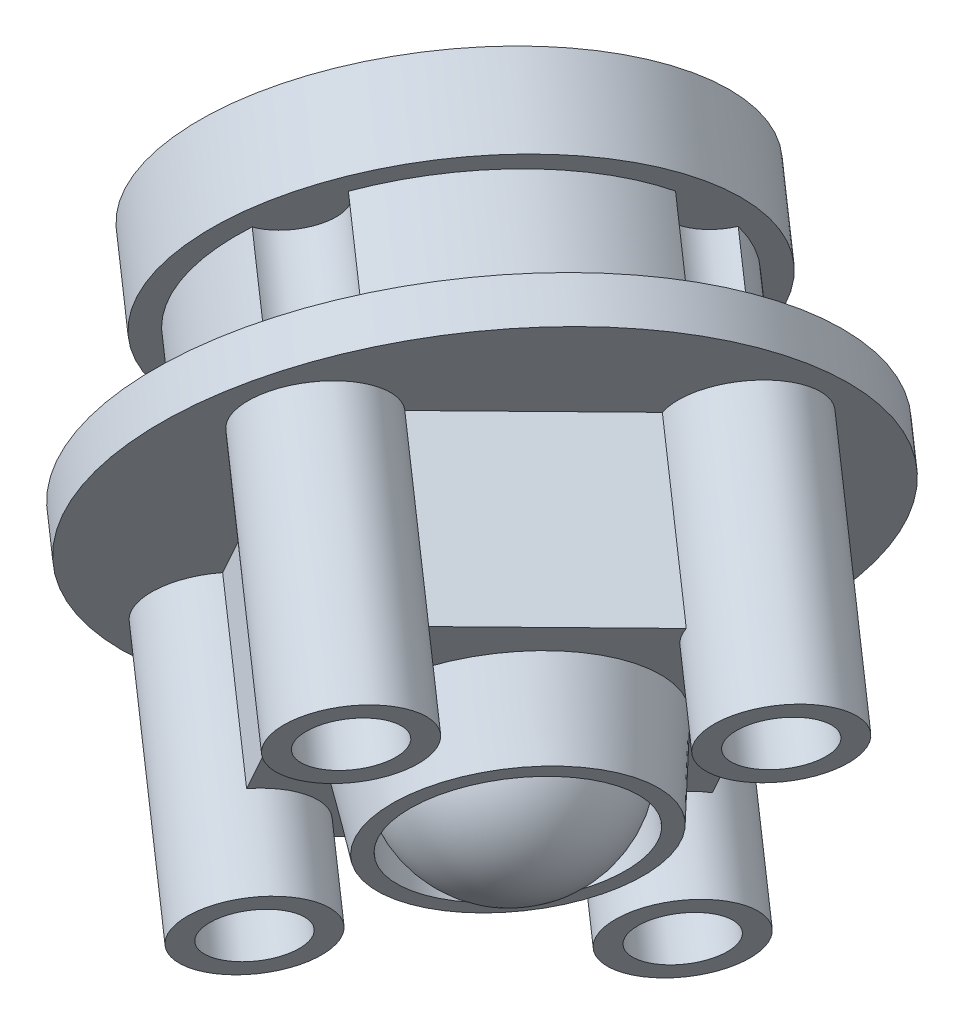
ISO-10303-21;
HEADER;
FILE_DESCRIPTION(('STEP AP214'),'2;1');
FILE_NAME('part.step','',(''),(''),'','','');
FILE_SCHEMA(('AUTOMOTIVE_DESIGN { 1 0 10303 214 1 1 1 1 }'));
ENDSEC;
DATA;
#1=APPLICATION_CONTEXT('core data for automotive mechanical design processes');
#2=APPLICATION_PROTOCOL_DEFINITION('international standard','automotive_design',2000,#1);
#3=PRODUCT_CONTEXT('',#1,'mechanical');
#4=PRODUCT('Part','Part','',(#3));
#5=PRODUCT_RELATED_PRODUCT_CATEGORY('part','',(#4));
#6=PRODUCT_DEFINITION_FORMATION('','',#4);
#7=PRODUCT_DEFINITION_CONTEXT('part definition',#1,'design');
#8=PRODUCT_DEFINITION('design','',#6,#7);
#9=PRODUCT_DEFINITION_SHAPE('','',#8);
#10=(LENGTH_UNIT() NAMED_UNIT(*) SI_UNIT(.MILLI.,.METRE.));
#11=(NAMED_UNIT(*) PLANE_ANGLE_UNIT() SI_UNIT($,.RADIAN.));
#12=(NAMED_UNIT(*) SI_UNIT($,.STERADIAN.) SOLID_ANGLE_UNIT());
#13=UNCERTAINTY_MEASURE_WITH_UNIT(LENGTH_MEASURE(1.E-05),#10,'distance_accuracy_value','');
#14=(GEOMETRIC_REPRESENTATION_CONTEXT(3) GLOBAL_UNCERTAINTY_ASSIGNED_CONTEXT((#13)) GLOBAL_UNIT_ASSIGNED_CONTEXT((#10,
#11,#12)) REPRESENTATION_CONTEXT('',''));
#15=CARTESIAN_POINT('',(0.,0.,0.));
#16=DIRECTION('',(0.,0.,1.));
#17=DIRECTION('',(1.,0.,0.));
#18=AXIS2_PLACEMENT_3D('',#15,#16,#17);
#19=CARTESIAN_POINT('',(174.649711908998,10.1944766292287,115.613424248542));
#20=DIRECTION('',(0.683170517972146,-0.488891727051665,0.54246006543718));
#21=DIRECTION('',(0.621841580193138,0.,-0.783143057903791));
#22=AXIS2_PLACEMENT_3D('',#19,#20,#21);
#23=CYLINDRICAL_SURFACE('',#22,5.01330239581798);
#24=CARTESIAN_POINT('',(176.699223462915,8.72780144807371,117.240804444854));
#25=DIRECTION('',(-0.683170517972146,0.488891727051666,-0.54246006543718));
#26=DIRECTION('',(-0.621841580193138,0.,0.783143057903791));
#27=AXIS2_PLACEMENT_3D('',#24,#25,#26);
#28=CIRCLE('',#27,5.01330239581798);
#29=CARTESIAN_POINT('',(176.195318190787,4.72360210727117,114.266637666115));
#30=VERTEX_POINT('',#29);
#31=CARTESIAN_POINT('',(173.151351657622,5.58709043908616,118.87840663194));
#32=VERTEX_POINT('',#31);
#33=EDGE_CURVE('E156',#30,#32,#28,.T.);
#34=ORIENTED_EDGE('',*,*,#33,.T.);
#35=DIRECTION('',(0.683170517972146,-0.488891727051666,0.54246006543718));
#36=VECTOR('',#35,1.);
#37=CARTESIAN_POINT('',(174.517692693566,4.60930698498274,119.963326762814));
#38=LINE('',#37,#36);
#39=CARTESIAN_POINT('',(171.101840103706,7.05376562024106,117.251026435628));
#40=VERTEX_POINT('',#39);
#41=EDGE_CURVE('E151',#32,#40,#38,.F.);
#42=ORIENTED_EDGE('',*,*,#41,.T.);
#43=CARTESIAN_POINT('',(174.649711908998,10.1944766292287,115.613424248542));
#44=DIRECTION('',(-0.683170517972146,0.488891727051666,-0.54246006543718));
#45=DIRECTION('',(-0.621841580193138,0.,0.783143057903791));
#46=AXIS2_PLACEMENT_3D('',#43,#44,#45);
#47=CIRCLE('',#46,5.01330239581798);
#48=CARTESIAN_POINT('',(174.145806636871,6.19027728842616,112.639257469804));
#49=VERTEX_POINT('',#48);
#50=EDGE_CURVE('E153',#49,#40,#47,.T.);
#51=ORIENTED_EDGE('',*,*,#50,.F.);
#52=DIRECTION('',(0.683170517972146,-0.488891727051666,0.54246006543718));
#53=VECTOR('',#52,1.);
#54=CARTESIAN_POINT('',(177.561659226731,3.74581865316777,115.35155779699));
#55=LINE('',#54,#53);
#56=EDGE_CURVE('E61',#49,#30,#55,.T.);
#57=ORIENTED_EDGE('',*,*,#56,.T.);
#58=EDGE_LOOP('',(#34,#42,#51,#57));
#59=FACE_BOUND('',#58,.T.);
#60=ADVANCED_FACE('F38',(#59),#23,.T.);
#61=CARTESIAN_POINT('',(171.019962030818,8.40674297223875,118.573512947455));
#62=VERTEX_POINT('',#61);
#63=CARTESIAN_POINT('',(173.652296445753,13.1529580790304,119.535891688404));
#64=VERTEX_POINT('',#63);
#65=EDGE_CURVE('E174',#62,#64,#47,.T.);
#66=ORIENTED_EDGE('',*,*,#65,.F.);
#67=DIRECTION('',(0.683170517972146,-0.488891727051666,0.54246006543718));
#68=VECTOR('',#67,1.);
#69=CARTESIAN_POINT('',(174.435814620679,5.96228433698036,121.285813274641));
#70=LINE('',#69,#68);
#71=CARTESIAN_POINT('',(173.069473584734,6.94006779108375,120.200893143766));
#72=VERTEX_POINT('',#71);
#73=EDGE_CURVE('E53',#62,#72,#70,.T.);
#74=ORIENTED_EDGE('',*,*,#73,.T.);
#75=CARTESIAN_POINT('',(175.70180799967,11.6862828978755,121.163271884715));
#76=VERTEX_POINT('',#75);
#77=EDGE_CURVE('E182',#72,#76,#28,.T.);
#78=ORIENTED_EDGE('',*,*,#77,.T.);
#79=DIRECTION('',(0.683170517972146,-0.488891727051666,0.54246006543718));
#80=VECTOR('',#79,1.);
#81=CARTESIAN_POINT('',(177.068149035614,10.7084994437721,122.24819201559));
#82=LINE('',#81,#80);
#83=EDGE_CURVE('E375',#76,#64,#82,.F.);
#84=ORIENTED_EDGE('',*,*,#83,.T.);
#85=EDGE_LOOP('',(#66,#74,#78,#84));
#86=FACE_BOUND('',#85,.T.);
#87=ADVANCED_FACE('F320',(#86),#23,.T.);
#88=CARTESIAN_POINT('',(180.339477568334,10.6117459060663,114.354196705813));
#89=VERTEX_POINT('',#88);
#90=CARTESIAN_POINT('',(177.609985412819,5.69125263493153,113.357109697848));
#91=VERTEX_POINT('',#90);
#92=EDGE_CURVE('E350',#89,#91,#28,.T.);
#93=ORIENTED_EDGE('',*,*,#92,.T.);
#94=DIRECTION('',(0.683170517972146,-0.488891727051666,0.54246006543718));
#95=VECTOR('',#94,1.);
#96=CARTESIAN_POINT('',(178.976326448763,4.7134691808281,114.442029828722));
#97=LINE('',#96,#95);
#98=CARTESIAN_POINT('',(175.560473858903,7.15792781608643,111.729729501536));
#99=VERTEX_POINT('',#98);
#100=EDGE_CURVE('E352',#91,#99,#97,.F.);
#101=ORIENTED_EDGE('',*,*,#100,.T.);
#102=CARTESIAN_POINT('',(178.289966014417,12.0784210872213,112.726816509501));
#103=VERTEX_POINT('',#102);
#104=EDGE_CURVE('E173',#103,#99,#47,.T.);
#105=ORIENTED_EDGE('',*,*,#104,.F.);
#106=DIRECTION('',(0.683170517972146,-0.488891727051666,0.54246006543718));
#107=VECTOR('',#106,1.);
#108=CARTESIAN_POINT('',(181.705818604278,9.63396245196293,115.439116836687));
#109=LINE('',#108,#107);
#110=EDGE_CURVE('E158',#103,#89,#109,.T.);
#111=ORIENTED_EDGE('',*,*,#110,.T.);
#112=EDGE_LOOP('',(#93,#101,#105,#111));
#113=FACE_BOUND('',#112,.T.);
#114=ADVANCED_FACE('F325',(#113),#23,.T.);
#115=CARTESIAN_POINT('',(180.100401983922,6.3239308852218,120.008165164388));
#116=DIRECTION('',(-0.683170517972146,0.488891727051666,-0.54246006543718));
#117=DIRECTION('',(0.621841580193138,0.,-0.783143057903791));
#118=AXIS2_PLACEMENT_3D('',#115,#116,#117);
#119=CONICAL_SURFACE('',#118,3.08209004523426,0.139626340159546);
#120=CARTESIAN_POINT('',(181.466743019866,5.34614743111847,121.093085295262));
#121=DIRECTION('',(0.683170517972146,-0.488891727051666,0.54246006543718));
#122=DIRECTION('',(0.621841580193138,0.,-0.783143057903791));
#123=AXIS2_PLACEMENT_3D('',#120,#121,#122);
#124=CIRCLE('',#123,2.80100837582948);
#125=CARTESIAN_POINT('',(183.208526494426,5.34614743111847,118.899495030601));
#126=VERTEX_POINT('',#125);
#127=EDGE_CURVE('E11',#126,#126,#124,.T.);
#128=ORIENTED_EDGE('',*,*,#127,.F.);
#129=EDGE_LOOP('',(#128));
#130=FACE_BOUND('',#129,.T.);
#131=CARTESIAN_POINT('',(180.100401983922,6.3239308852218,120.008165164388));
#132=DIRECTION('',(0.683170517972146,-0.488891727051666,0.54246006543718));
#133=DIRECTION('',(0.621841580193138,0.,-0.783143057903791));
#134=AXIS2_PLACEMENT_3D('',#131,#132,#133);
#135=CIRCLE('',#134,3.08209004523426);
#136=CARTESIAN_POINT('',(182.016973727948,6.3239308852218,117.594447741628));
#137=VERTEX_POINT('',#136);
#138=EDGE_CURVE('E213',#137,#137,#135,.T.);
#139=ORIENTED_EDGE('',*,*,#138,.T.);
#140=EDGE_LOOP('',(#139));
#141=FACE_BOUND('',#140,.T.);
#142=ADVANCED_FACE('F220',(#130,#141),#119,.T.);
#143=CARTESIAN_POINT('',(181.466743019866,5.34614743111847,121.093085295262));
#144=DIRECTION('',(0.683170517972146,-0.488891727051666,0.54246006543718));
#145=DIRECTION('',(0.621841580193138,0.,-0.783143057903791));
#146=AXIS2_PLACEMENT_3D('',#143,#144,#145);
#147=PLANE('',#146);
#148=CARTESIAN_POINT('',(181.466743019866,5.34614743111841,121.093085295262));
#149=DIRECTION('',(0.683170517972146,-0.488891727051666,0.54246006543718));
#150=DIRECTION('',(0.621841580193138,0.,-0.783143057903791));
#151=AXIS2_PLACEMENT_3D('',#148,#149,#150);
#152=CIRCLE('',#151,2.40864300072666);
#153=CARTESIAN_POINT('',(182.964537389559,5.34614743111841,119.206773250274));
#154=VERTEX_POINT('',#153);
#155=EDGE_CURVE('E214',#154,#154,#152,.T.);
#156=ORIENTED_EDGE('',*,*,#155,.F.);
#157=EDGE_LOOP('',(#156));
#158=FACE_BOUND('',#157,.T.);
#159=ORIENTED_EDGE('',*,*,#127,.T.);
#160=EDGE_LOOP('',(#159));
#161=FACE_BOUND('',#160,.T.);
#162=ADVANCED_FACE('F344',(#158,#161),#147,.T.);
#163=CARTESIAN_POINT('',(180.783572501894,5.83503915817008,120.550625229825));
#164=DIRECTION('',(0.683170517972146,-0.488891727051666,0.54246006543718));
#165=DIRECTION('',(0.621841580193138,0.,-0.783143057903791));
#166=AXIS2_PLACEMENT_3D('',#163,#164,#165);
#167=CYLINDRICAL_SURFACE('',#166,2.40864300072666);
#168=CARTESIAN_POINT('',(180.783572501894,5.83503915817008,120.550625229825));
#169=DIRECTION('',(0.683170517972146,-0.488891727051666,0.54246006543718));
#170=DIRECTION('',(0.621841580193138,0.,-0.783143057903791));
#171=AXIS2_PLACEMENT_3D('',#168,#169,#170);
#172=CIRCLE('',#171,2.40864300072666);
#173=CARTESIAN_POINT('',(182.281366871587,5.83503915817008,118.664313184837));
#174=VERTEX_POINT('',#173);
#175=EDGE_CURVE('E42',#174,#174,#172,.T.);
#176=ORIENTED_EDGE('',*,*,#175,.F.);
#177=EDGE_LOOP('',(#176));
#178=FACE_BOUND('',#177,.T.);
#179=ORIENTED_EDGE('',*,*,#155,.T.);
#180=EDGE_LOOP('',(#179));
#181=FACE_BOUND('',#180,.T.);
#182=ADVANCED_FACE('F480',(#178,#181),#167,.F.);
#183=CARTESIAN_POINT('',(180.475879143588,6.05523123816705,120.306306491105));
#184=DIRECTION('',(0.,0.,1.));
#185=DIRECTION('',(1.,0.,0.));
#186=AXIS2_PLACEMENT_3D('',#183,#184,#185);
#187=SPHERICAL_SURFACE('',#186,2.45039027623739);
#188=CARTESIAN_POINT('',(180.475879143588,6.05523123816705,120.306306491105));
#189=DIRECTION('',(0.683170517972146,-0.488891727051666,0.54246006543718));
#190=DIRECTION('',(0.621841580193138,0.,-0.783143057903791));
#191=AXIS2_PLACEMENT_3D('',#188,#189,#190);
#192=SPHERICAL_SURFACE('',#191,2.45039027623739);
#193=ORIENTED_EDGE('',*,*,#175,.T.);
#194=EDGE_LOOP('',(#193));
#195=FACE_BOUND('',#194,.T.);
#196=ADVANCED_FACE('F40',(#195),#192,.T.);
#197=CARTESIAN_POINT('',(123.848229960972,-89.7875099438735,104.231404175565));
#198=DIRECTION('',(-0.549312188007974,0.145426232650755,0.822865317632783));
#199=DIRECTION('',(0.831707114977743,0.,0.555214620570639));
#200=AXIS2_PLACEMENT_3D('',#197,#198,#199);
#201=PLANE('',#200);
#202=DIRECTION('',(-0.481179969948417,-0.860137250720751,-0.169203269598991));
#203=VECTOR('',#202,1.);
#204=CARTESIAN_POINT('',(173.74160531901,6.24020289946287,120.567115972025));
#205=LINE('',#204,#203);
#206=CARTESIAN_POINT('',(176.211888789104,10.6559786282308,121.435772329482));
#207=VERTEX_POINT('',#206);
#208=CARTESIAN_POINT('',(174.123093296577,6.92213490141914,120.701263312207));
#209=VERTEX_POINT('',#208);
#210=EDGE_CURVE('E190',#207,#209,#205,.T.);
#211=ORIENTED_EDGE('',*,*,#210,.T.);
#212=DIRECTION('',(-0.683170517972146,0.488891727051666,-0.54246006543718));
#213=VECTOR('',#212,1.);
#214=CARTESIAN_POINT('',(178.22211640441,3.98878453910911,123.95602370483));
#215=LINE('',#214,#213);
#216=CARTESIAN_POINT('',(176.855775368466,4.96656799321248,122.871103573956));
#217=VERTEX_POINT('',#216);
#218=EDGE_CURVE('E387',#209,#217,#215,.F.);
#219=ORIENTED_EDGE('',*,*,#218,.T.);
#220=DIRECTION('',(0.48117996994842,0.860137250720749,0.169203269598993));
#221=VECTOR('',#220,1.);
#222=CARTESIAN_POINT('',(123.848229960972,-89.7875099438735,104.231404175565));
#223=LINE('',#222,#221);
#224=CARTESIAN_POINT('',(178.944570860992,8.70041172002413,123.60561259123));
#225=VERTEX_POINT('',#224);
#226=EDGE_CURVE('E229',#217,#225,#223,.T.);
#227=ORIENTED_EDGE('',*,*,#226,.T.);
#228=DIRECTION('',(-0.683170517972146,0.488891727051666,-0.54246006543718));
#229=VECTOR('',#228,1.);
#230=CARTESIAN_POINT('',(180.310911896937,7.72262826592077,124.690532722105));
#231=LINE('',#230,#229);
#232=EDGE_CURVE('E258',#225,#207,#231,.T.);
#233=ORIENTED_EDGE('',*,*,#232,.T.);
#234=EDGE_LOOP('',(#211,#219,#227,#233));
#235=FACE_BOUND('',#234,.T.);
#236=ADVANCED_FACE('F390',(#235),#201,.T.);
#237=CARTESIAN_POINT('',(178.563672039093,2.74396126774131,118.717067475701));
#238=DIRECTION('',(-0.481179969948421,-0.860137250720748,-0.169203269598991));
#239=DIRECTION('',(0.872720859607662,-0.488219521532746,0.));
#240=AXIS2_PLACEMENT_3D('',#237,#238,#239);
#241=PLANE('',#240);
#242=DIRECTION('',(-0.549312188007973,0.145426232650758,0.822865317632784));
#243=VECTOR('',#242,1.);
#244=CARTESIAN_POINT('',(178.563672039093,2.74396126774131,118.717067475701));
#245=LINE('',#244,#243);
#246=CARTESIAN_POINT('',(179.370762845876,2.53029010223683,117.5080518238));
#247=VERTEX_POINT('',#246);
#248=CARTESIAN_POINT('',(176.944833481188,3.17253648941936,121.142074845331));
#249=VERTEX_POINT('',#248);
#250=EDGE_CURVE('E237',#247,#249,#245,.T.);
#251=ORIENTED_EDGE('',*,*,#250,.T.);
#252=DIRECTION('',(-0.683170517972146,0.488891727051666,-0.54246006543718));
#253=VECTOR('',#252,1.);
#254=CARTESIAN_POINT('',(178.311174517132,2.19475303531599,122.226994976206));
#255=LINE('',#254,#253);
#256=CARTESIAN_POINT('',(174.212151409299,5.12810339762605,118.972234583582));
#257=VERTEX_POINT('',#256);
#258=EDGE_CURVE('E385',#249,#257,#255,.T.);
#259=ORIENTED_EDGE('',*,*,#258,.T.);
#260=DIRECTION('',(0.549312188007974,-0.145426232650759,-0.822865317632782));
#261=VECTOR('',#260,1.);
#262=CARTESIAN_POINT('',(177.105610665117,4.36208202018682,114.637855478997));
#263=LINE('',#262,#261);
#264=CARTESIAN_POINT('',(176.638080773988,4.48585701044353,115.338211562051));
#265=VERTEX_POINT('',#264);
#266=EDGE_CURVE('E193',#257,#265,#263,.T.);
#267=ORIENTED_EDGE('',*,*,#266,.T.);
#268=DIRECTION('',(-0.683170517972146,0.488891727051666,-0.54246006543718));
#269=VECTOR('',#268,1.);
#270=CARTESIAN_POINT('',(180.73710388182,1.55250664813348,118.592971954674));
#271=LINE('',#270,#269);
#272=EDGE_CURVE('E243',#265,#247,#271,.F.);
#273=ORIENTED_EDGE('',*,*,#272,.T.);
#274=EDGE_LOOP('',(#251,#259,#267,#273));
#275=FACE_BOUND('',#274,.T.);
#276=ADVANCED_FACE('F278',(#275),#241,.T.);
#277=CARTESIAN_POINT('',(182.413111798681,9.62505927350733,120.070693632493));
#278=DIRECTION('',(-0.481179969948422,-0.860137250720748,-0.169203269598989));
#279=DIRECTION('',(0.872720859607662,-0.488219521532747,0.));
#280=AXIS2_PLACEMENT_3D('',#277,#278,#279);
#281=PLANE('',#280);
#282=DIRECTION('',(-0.683170517972146,0.488891727051666,-0.54246006543718));
#283=VECTOR('',#282,1.);
#284=CARTESIAN_POINT('',(184.57879720858,8.43565546319758,119.95820220664));
#285=LINE('',#284,#283);
#286=CARTESIAN_POINT('',(180.479774100747,11.3690058255076,116.703441814017));
#287=VERTEX_POINT('',#286);
#288=CARTESIAN_POINT('',(183.212456172635,9.41343891730095,118.873282075765));
#289=VERTEX_POINT('',#288);
#290=EDGE_CURVE('E290',#287,#289,#285,.F.);
#291=ORIENTED_EDGE('',*,*,#290,.F.);
#292=DIRECTION('',(-0.549312188007972,0.145426232650759,0.822865317632784));
#293=VECTOR('',#292,1.);
#294=CARTESIAN_POINT('',(180.955050424704,11.2431800259528,115.991481635789));
#295=LINE('',#294,#293);
#296=CARTESIAN_POINT('',(178.051817765304,12.0117888378133,120.340501221724));
#297=VERTEX_POINT('',#296);
#298=EDGE_CURVE('E188',#287,#297,#295,.T.);
#299=ORIENTED_EDGE('',*,*,#298,.T.);
#300=DIRECTION('',(-0.683170517972146,0.488891727051666,-0.54246006543718));
#301=VECTOR('',#300,1.);
#302=CARTESIAN_POINT('',(182.150840873137,9.07843847550325,123.595261614347));
#303=LINE('',#302,#301);
#304=CARTESIAN_POINT('',(180.784499837192,10.0562219296066,122.510341483473));
#305=VERTEX_POINT('',#304);
#306=EDGE_CURVE('E256',#305,#297,#303,.T.);
#307=ORIENTED_EDGE('',*,*,#306,.F.);
#308=DIRECTION('',(-0.549312188007972,0.145426232650759,0.822865317632784));
#309=VECTOR('',#308,1.);
#310=CARTESIAN_POINT('',(182.413111798681,9.62505927350733,120.070693632493));
#311=LINE('',#310,#309);
#312=EDGE_CURVE('E180',#289,#305,#311,.T.);
#313=ORIENTED_EDGE('',*,*,#312,.F.);
#314=EDGE_LOOP('',(#291,#299,#307,#313));
#315=FACE_BOUND('',#314,.T.);
#316=ADVANCED_FACE('F259',(#315),#281,.F.);
#317=CARTESIAN_POINT('',(128.242727465036,-90.9509198050795,97.6484816345031));
#318=DIRECTION('',(-0.549312188007973,0.145426232650757,0.822865317632783));
#319=DIRECTION('',(0.831707114977744,0.,0.555214620570638));
#320=AXIS2_PLACEMENT_3D('',#317,#318,#319);
#321=PLANE('',#320);
#322=DIRECTION('',(-0.683170517972146,0.488891727051666,-0.54246006543718));
#323=VECTOR('',#322,1.);
#324=CARTESIAN_POINT('',(184.789182585155,6.70896785565481,118.137068382857));
#325=LINE('',#324,#323);
#326=CARTESIAN_POINT('',(183.422841549211,7.68675130975818,117.052148251982));
#327=VERTEX_POINT('',#326);
#328=CARTESIAN_POINT('',(180.690159477322,9.64231821796485,114.882307990234));
#329=VERTEX_POINT('',#328);
#330=EDGE_CURVE('E287',#327,#329,#325,.T.);
#331=ORIENTED_EDGE('',*,*,#330,.F.);
#332=DIRECTION('',(0.481179969948421,0.860137250720748,0.169203269598991));
#333=VECTOR('',#332,1.);
#334=CARTESIAN_POINT('',(128.242727465036,-90.9509198050795,97.6484816345031));
#335=LINE('',#334,#333);
#336=CARTESIAN_POINT('',(181.237575941596,3.78046162768801,116.283716253887));
#337=VERTEX_POINT('',#336);
#338=EDGE_CURVE('E240',#337,#327,#335,.T.);
#339=ORIENTED_EDGE('',*,*,#338,.F.);
#340=DIRECTION('',(-0.683170517972146,0.488891727051666,-0.54246006543718));
#341=VECTOR('',#340,1.);
#342=CARTESIAN_POINT('',(182.603916977541,2.80267817358465,117.368636384762));
#343=LINE('',#342,#341);
#344=CARTESIAN_POINT('',(178.504893869708,5.73602853589468,114.113875992139));
#345=VERTEX_POINT('',#344);
#346=EDGE_CURVE('E274',#345,#337,#343,.F.);
#347=ORIENTED_EDGE('',*,*,#346,.F.);
#348=DIRECTION('',(0.481179969948421,0.860137250720749,0.169203269598991));
#349=VECTOR('',#348,1.);
#350=CARTESIAN_POINT('',(178.136102823073,5.07679303825681,113.984193430963));
#351=LINE('',#350,#349);
#352=EDGE_CURVE('E185',#345,#329,#351,.T.);
#353=ORIENTED_EDGE('',*,*,#352,.T.);
#354=EDGE_LOOP('',(#331,#339,#347,#353));
#355=FACE_BOUND('',#354,.T.);
#356=ADVANCED_FACE('F285',(#355),#321,.F.);
#357=CARTESIAN_POINT('',(177.382393980887,8.2389097210221,117.783264510291));
#358=DIRECTION('',(0.683170517972146,-0.488891727051666,0.54246006543718));
#359=DIRECTION('',(0.621841580193138,0.,-0.783143057903791));
#360=AXIS2_PLACEMENT_3D('',#357,#358,#359);
#361=PLANE('',#360);
#362=CARTESIAN_POINT('',(177.382393980887,8.2389097210221,117.783264510291));
#363=DIRECTION('',(0.683170517972146,-0.488891727051666,0.54246006543718));
#364=DIRECTION('',(0.621841580193138,0.,-0.783143057903791));
#365=AXIS2_PLACEMENT_3D('',#362,#363,#364);
#366=CIRCLE('',#365,7.23648544027235);
#367=CARTESIAN_POINT('',(181.88234152211,8.2389097210221,112.11606117412));
#368=VERTEX_POINT('',#367);
#369=EDGE_CURVE('E196',#368,#368,#366,.T.);
#370=ORIENTED_EDGE('',*,*,#369,.T.);
#371=EDGE_LOOP('',(#370));
#372=FACE_BOUND('',#371,.T.);
#373=ORIENTED_EDGE('',*,*,#266,.F.);
#374=CARTESIAN_POINT('',(173.55912362794,5.61369802716014,120.232295126787));
#375=DIRECTION('',(0.683170517972146,-0.488891727051666,0.54246006543718));
#376=DIRECTION('',(0.621841580193138,0.,-0.783143057903791));
#377=AXIS2_PLACEMENT_3D('',#374,#375,#376);
#378=CIRCLE('',#377,1.49999999999999);
#379=EDGE_CURVE('E295',#257,#209,#378,.F.);
#380=ORIENTED_EDGE('',*,*,#379,.T.);
#381=ORIENTED_EDGE('',*,*,#210,.F.);
#382=CARTESIAN_POINT('',(177.068513630742,11.886937266608,121.466345377955));
#383=DIRECTION('',(0.683170517972146,-0.488891727051666,0.54246006543718));
#384=DIRECTION('',(0.621841580193138,0.,-0.783143057903791));
#385=AXIS2_PLACEMENT_3D('',#382,#383,#384);
#386=CIRCLE('',#385,1.5);
#387=EDGE_CURVE('E263',#207,#297,#386,.F.);
#388=ORIENTED_EDGE('',*,*,#387,.T.);
#389=ORIENTED_EDGE('',*,*,#298,.F.);
#390=CARTESIAN_POINT('',(181.176316196127,10.9452975596969,115.444354678491));
#391=DIRECTION('',(0.683170517972146,-0.488891727051666,0.54246006543718));
#392=DIRECTION('',(0.621841580193138,0.,-0.783143057903791));
#393=AXIS2_PLACEMENT_3D('',#390,#391,#392);
#394=CIRCLE('',#393,1.5);
#395=EDGE_CURVE('E266',#287,#329,#394,.F.);
#396=ORIENTED_EDGE('',*,*,#395,.T.);
#397=ORIENTED_EDGE('',*,*,#352,.F.);
#398=CARTESIAN_POINT('',(177.595849940104,4.54500537362728,114.185311004514));
#399=DIRECTION('',(0.683170517972146,-0.488891727051666,0.54246006543718));
#400=DIRECTION('',(0.621841580193138,0.,-0.783143057903791));
#401=AXIS2_PLACEMENT_3D('',#398,#399,#400);
#402=CIRCLE('',#401,1.5);
#403=EDGE_CURVE('E238',#345,#265,#402,.F.);
#404=ORIENTED_EDGE('',*,*,#403,.T.);
#405=EDGE_LOOP('',(#373,#380,#381,#388,#389,#396,#397,#404));
#406=FACE_BOUND('',#405,.T.);
#407=ADVANCED_FACE('F299',(#372,#406),#361,.T.);
#408=CARTESIAN_POINT('',(176.699223462915,8.72780144807377,117.240804444854));
#409=DIRECTION('',(0.683170517972146,-0.488891727051666,0.54246006543718));
#410=DIRECTION('',(0.621841580193138,0.,-0.783143057903791));
#411=AXIS2_PLACEMENT_3D('',#408,#409,#410);
#412=PLANE('',#411);
#413=ORIENTED_EDGE('',*,*,#77,.F.);
#414=CARTESIAN_POINT('',(172.875953109968,6.1025897542118,119.68983506135));
#415=DIRECTION('',(0.683170517972146,-0.488891727051666,0.54246006543718));
#416=DIRECTION('',(0.621841580193138,0.,-0.783143057903791));
#417=AXIS2_PLACEMENT_3D('',#414,#415,#416);
#418=CIRCLE('',#417,1.);
#419=EDGE_CURVE('E159',#72,#32,#418,.T.);
#420=ORIENTED_EDGE('',*,*,#419,.T.);
#421=ORIENTED_EDGE('',*,*,#33,.F.);
#422=CARTESIAN_POINT('',(176.912679422132,5.03389710067895,113.642850939077));
#423=DIRECTION('',(0.683170517972146,-0.488891727051666,0.54246006543718));
#424=DIRECTION('',(0.621841580193138,0.,-0.783143057903791));
#425=AXIS2_PLACEMENT_3D('',#422,#423,#424);
#426=CIRCLE('',#425,1.00000000000001);
#427=EDGE_CURVE('E379',#30,#91,#426,.T.);
#428=ORIENTED_EDGE('',*,*,#427,.T.);
#429=ORIENTED_EDGE('',*,*,#92,.F.);
#430=CARTESIAN_POINT('',(180.493145678155,11.4341892867486,114.901894613053));
#431=DIRECTION('',(0.683170517972146,-0.488891727051666,0.54246006543718));
#432=DIRECTION('',(0.621841580193138,0.,-0.783143057903791));
#433=AXIS2_PLACEMENT_3D('',#430,#431,#432);
#434=CIRCLE('',#433,0.999999999999989);
#435=CARTESIAN_POINT('',(180.220425899064,11.9524696056599,115.712455797124));
#436=VERTEX_POINT('',#435);
#437=EDGE_CURVE('E367',#89,#436,#434,.T.);
#438=ORIENTED_EDGE('',*,*,#437,.T.);
#439=CARTESIAN_POINT('',(177.101911073026,12.6814557511291,120.296890381556));
#440=VERTEX_POINT('',#439);
#441=EDGE_CURVE('E177',#440,#436,#28,.T.);
#442=ORIENTED_EDGE('',*,*,#441,.F.);
#443=CARTESIAN_POINT('',(176.38534311277,12.3758289936597,120.923885312518));
#444=DIRECTION('',(0.683170517972146,-0.488891727051666,0.54246006543718));
#445=DIRECTION('',(0.621841580193138,0.,-0.783143057903791));
#446=AXIS2_PLACEMENT_3D('',#443,#444,#445);
#447=CIRCLE('',#446,0.999999999999989);
#448=EDGE_CURVE('E366',#440,#76,#447,.T.);
#449=ORIENTED_EDGE('',*,*,#448,.T.);
#450=EDGE_LOOP('',(#413,#420,#421,#428,#429,#438,#442,#449));
#451=FACE_BOUND('',#450,.T.);
#452=CARTESIAN_POINT('',(176.699223462915,8.72780144807377,117.240804444854));
#453=DIRECTION('',(0.683170517972146,-0.488891727051666,0.54246006543718));
#454=DIRECTION('',(0.621841580193138,0.,-0.783143057903791));
#455=AXIS2_PLACEMENT_3D('',#452,#453,#454);
#456=CIRCLE('',#455,7.23648544027235);
#457=CARTESIAN_POINT('',(181.199171004138,8.72780144807377,111.573601108683));
#458=VERTEX_POINT('',#457);
#459=EDGE_CURVE('E195',#458,#458,#456,.T.);
#460=ORIENTED_EDGE('',*,*,#459,.F.);
#461=EDGE_LOOP('',(#460));
#462=FACE_BOUND('',#461,.T.);
#463=ADVANCED_FACE('F335',(#451,#462),#412,.F.);
#464=CARTESIAN_POINT('',(177.382393980887,8.2389097210221,117.783264510291));
#465=DIRECTION('',(-0.683170517972146,0.488891727051666,-0.54246006543718));
#466=DIRECTION('',(-0.621841580193138,0.,0.783143057903791));
#467=AXIS2_PLACEMENT_3D('',#464,#465,#466);
#468=CYLINDRICAL_SURFACE('',#467,7.23648544027235);
#469=ORIENTED_EDGE('',*,*,#369,.F.);
#470=EDGE_LOOP('',(#469));
#471=FACE_BOUND('',#470,.T.);
#472=ORIENTED_EDGE('',*,*,#459,.T.);
#473=EDGE_LOOP('',(#472));
#474=FACE_BOUND('',#473,.T.);
#475=ADVANCED_FACE('F330',(#471,#474),#468,.T.);
#476=CARTESIAN_POINT('',(175.05239951911,14.1481309322841,118.669510185245));
#477=VERTEX_POINT('',#476);
#478=CARTESIAN_POINT('',(178.170914345148,13.4191447868148,114.085075600813));
#479=VERTEX_POINT('',#478);
#480=EDGE_CURVE('E176',#477,#479,#47,.T.);
#481=ORIENTED_EDGE('',*,*,#480,.F.);
#482=DIRECTION('',(0.683170517972146,-0.488891727051666,0.54246006543718));
#483=VECTOR('',#482,1.);
#484=CARTESIAN_POINT('',(178.468252108971,11.7036722970257,121.381810512431));
#485=LINE('',#484,#483);
#486=EDGE_CURVE('E362',#477,#440,#485,.T.);
#487=ORIENTED_EDGE('',*,*,#486,.T.);
#488=ORIENTED_EDGE('',*,*,#441,.T.);
#489=DIRECTION('',(0.683170517972146,-0.488891727051666,0.54246006543718));
#490=VECTOR('',#489,1.);
#491=CARTESIAN_POINT('',(181.586766935009,10.9746861515565,116.797375927999));
#492=LINE('',#491,#490);
#493=EDGE_CURVE('E360',#436,#479,#492,.F.);
#494=ORIENTED_EDGE('',*,*,#493,.T.);
#495=EDGE_LOOP('',(#481,#487,#488,#494));
#496=FACE_BOUND('',#495,.T.);
#497=ADVANCED_FACE('F226',(#496),#23,.T.);
#498=CARTESIAN_POINT('',(126.418794579115,-90.4680474166675,100.380718687091));
#499=DIRECTION('',(0.683170517972146,-0.488891727051665,0.54246006543718));
#500=DIRECTION('',(0.621841580193138,0.,-0.783143057903791));
#501=AXIS2_PLACEMENT_3D('',#498,#499,#500);
#502=PLANE('',#501);
#503=ORIENTED_EDGE('',*,*,#138,.F.);
#504=EDGE_LOOP('',(#503));
#505=FACE_BOUND('',#504,.T.);
#506=ORIENTED_EDGE('',*,*,#226,.F.);
#507=CARTESIAN_POINT('',(176.291805699829,3.65813111895346,122.402135388536));
#508=DIRECTION('',(0.683170517972146,-0.488891727051665,0.54246006543718));
#509=DIRECTION('',(0.621841580193138,0.,-0.783143057903791));
#510=AXIS2_PLACEMENT_3D('',#507,#508,#509);
#511=CIRCLE('',#510,1.49999999999999);
#512=EDGE_CURVE('E210',#217,#249,#511,.F.);
#513=ORIENTED_EDGE('',*,*,#512,.T.);
#514=ORIENTED_EDGE('',*,*,#250,.F.);
#515=CARTESIAN_POINT('',(180.328532011992,2.58943846542061,116.355151266262));
#516=DIRECTION('',(0.683170517972146,-0.488891727051665,0.54246006543718));
#517=DIRECTION('',(0.621841580193138,0.,-0.783143057903791));
#518=AXIS2_PLACEMENT_3D('',#515,#516,#517);
#519=CIRCLE('',#518,1.5);
#520=EDGE_CURVE('E199',#247,#337,#519,.F.);
#521=ORIENTED_EDGE('',*,*,#520,.T.);
#522=ORIENTED_EDGE('',*,*,#338,.T.);
#523=CARTESIAN_POINT('',(183.908998268015,8.98973065149022,117.614194940239));
#524=DIRECTION('',(0.683170517972146,-0.488891727051665,0.54246006543718));
#525=DIRECTION('',(0.621841580193138,0.,-0.783143057903791));
#526=AXIS2_PLACEMENT_3D('',#523,#524,#525);
#527=CIRCLE('',#526,1.5);
#528=EDGE_CURVE('E207',#327,#289,#527,.F.);
#529=ORIENTED_EDGE('',*,*,#528,.T.);
#530=ORIENTED_EDGE('',*,*,#312,.T.);
#531=CARTESIAN_POINT('',(179.80119570263,9.93137035840134,123.636185639704));
#532=DIRECTION('',(0.683170517972146,-0.488891727051665,0.54246006543718));
#533=DIRECTION('',(0.621841580193138,0.,-0.783143057903791));
#534=AXIS2_PLACEMENT_3D('',#531,#532,#533);
#535=CIRCLE('',#534,1.5);
#536=EDGE_CURVE('E204',#305,#225,#535,.F.);
#537=ORIENTED_EDGE('',*,*,#536,.T.);
#538=EDGE_LOOP('',(#506,#513,#514,#521,#522,#529,#530,#537));
#539=FACE_BOUND('',#538,.T.);
#540=ADVANCED_FACE('F222',(#505,#539),#502,.T.);
#541=CARTESIAN_POINT('',(181.694873047937,1.61165501131725,117.440071397137));
#542=DIRECTION('',(-0.683170517972146,0.488891727051666,-0.54246006543718));
#543=DIRECTION('',(-0.621841580193138,0.,0.783143057903791));
#544=AXIS2_PLACEMENT_3D('',#541,#542,#543);
#545=CYLINDRICAL_SURFACE('',#544,1.5);
#546=ORIENTED_EDGE('',*,*,#403,.F.);
#547=ORIENTED_EDGE('',*,*,#346,.T.);
#548=ORIENTED_EDGE('',*,*,#520,.F.);
#549=ORIENTED_EDGE('',*,*,#272,.F.);
#550=EDGE_LOOP('',(#546,#547,#548,#549));
#551=FACE_BOUND('',#550,.T.);
#552=CARTESIAN_POINT('',(181.694873047937,1.61165501131725,117.440071397137));
#553=DIRECTION('',(0.683170517972146,-0.488891727051666,0.54246006543718));
#554=DIRECTION('',(0.621841580193138,0.,-0.783143057903791));
#555=AXIS2_PLACEMENT_3D('',#552,#553,#554);
#556=CIRCLE('',#555,1.5);
#557=CARTESIAN_POINT('',(182.627635418226,1.61165501131725,116.265356810281));
#558=VERTEX_POINT('',#557);
#559=EDGE_CURVE('E271',#558,#558,#556,.T.);
#560=ORIENTED_EDGE('',*,*,#559,.F.);
#561=EDGE_LOOP('',(#560));
#562=FACE_BOUND('',#561,.T.);
#563=ADVANCED_FACE('F225',(#551,#562),#545,.T.);
#564=CARTESIAN_POINT('',(181.694873047937,1.61165501131725,117.440071397137));
#565=DIRECTION('',(0.683170517972146,-0.488891727051666,0.54246006543718));
#566=DIRECTION('',(0.621841580193138,0.,-0.783143057903791));
#567=AXIS2_PLACEMENT_3D('',#564,#565,#566);
#568=PLANE('',#567);
#569=CARTESIAN_POINT('',(181.694873047937,1.61165501131719,117.440071397137));
#570=DIRECTION('',(0.683170517972146,-0.488891727051666,0.54246006543718));
#571=DIRECTION('',(0.621841580193138,0.,-0.783143057903791));
#572=AXIS2_PLACEMENT_3D('',#569,#570,#571);
#573=CIRCLE('',#572,1.00000000000001);
#574=CARTESIAN_POINT('',(182.31671462813,1.61165501131719,116.656928339233));
#575=VERTEX_POINT('',#574);
#576=EDGE_CURVE('E430',#575,#575,#573,.T.);
#577=ORIENTED_EDGE('',*,*,#576,.F.);
#578=EDGE_LOOP('',(#577));
#579=FACE_BOUND('',#578,.T.);
#580=ORIENTED_EDGE('',*,*,#559,.T.);
#581=EDGE_LOOP('',(#580));
#582=FACE_BOUND('',#581,.T.);
#583=ADVANCED_FACE('F461',(#579,#582),#568,.T.);
#584=CARTESIAN_POINT('',(181.167536738575,8.95358690429797,124.721105770578));
#585=DIRECTION('',(-0.683170517972146,0.488891727051666,-0.54246006543718));
#586=DIRECTION('',(-0.621841580193138,0.,0.783143057903791));
#587=AXIS2_PLACEMENT_3D('',#584,#585,#586);
#588=CYLINDRICAL_SURFACE('',#587,1.5);
#589=ORIENTED_EDGE('',*,*,#387,.F.);
#590=ORIENTED_EDGE('',*,*,#232,.F.);
#591=ORIENTED_EDGE('',*,*,#536,.F.);
#592=ORIENTED_EDGE('',*,*,#306,.T.);
#593=EDGE_LOOP('',(#589,#590,#591,#592));
#594=FACE_BOUND('',#593,.T.);
#595=CARTESIAN_POINT('',(181.167536738575,8.95358690429797,124.721105770578));
#596=DIRECTION('',(0.683170517972146,-0.488891727051666,0.54246006543718));
#597=DIRECTION('',(0.621841580193138,0.,-0.783143057903791));
#598=AXIS2_PLACEMENT_3D('',#595,#596,#597);
#599=CIRCLE('',#598,1.5);
#600=CARTESIAN_POINT('',(182.100299108864,8.95358690429797,123.546391183723));
#601=VERTEX_POINT('',#600);
#602=EDGE_CURVE('E261',#601,#601,#599,.T.);
#603=ORIENTED_EDGE('',*,*,#602,.F.);
#604=EDGE_LOOP('',(#603));
#605=FACE_BOUND('',#604,.T.);
#606=ADVANCED_FACE('F254',(#594,#605),#588,.T.);
#607=CARTESIAN_POINT('',(181.167536738575,8.95358690429797,124.721105770578));
#608=DIRECTION('',(0.683170517972146,-0.488891727051666,0.54246006543718));
#609=DIRECTION('',(0.621841580193138,0.,-0.783143057903791));
#610=AXIS2_PLACEMENT_3D('',#607,#608,#609);
#611=PLANE('',#610);
#612=CARTESIAN_POINT('',(181.167536738575,8.95358690429791,124.721105770578));
#613=DIRECTION('',(0.683170517972146,-0.488891727051666,0.54246006543718));
#614=DIRECTION('',(0.621841580193138,0.,-0.783143057903791));
#615=AXIS2_PLACEMENT_3D('',#612,#613,#614);
#616=CIRCLE('',#615,0.999999999999989);
#617=CARTESIAN_POINT('',(181.789378318768,8.95358690429791,123.937962712675));
#618=VERTEX_POINT('',#617);
#619=EDGE_CURVE('E166',#618,#618,#616,.T.);
#620=ORIENTED_EDGE('',*,*,#619,.F.);
#621=EDGE_LOOP('',(#620));
#622=FACE_BOUND('',#621,.T.);
#623=ORIENTED_EDGE('',*,*,#602,.T.);
#624=EDGE_LOOP('',(#623));
#625=FACE_BOUND('',#624,.T.);
#626=ADVANCED_FACE('F304',(#622,#625),#611,.T.);
#627=CARTESIAN_POINT('',(185.27533930396,8.01194719738685,118.699115071114));
#628=DIRECTION('',(-0.683170517972146,0.488891727051666,-0.54246006543718));
#629=DIRECTION('',(-0.621841580193138,0.,0.783143057903791));
#630=AXIS2_PLACEMENT_3D('',#627,#628,#629);
#631=CYLINDRICAL_SURFACE('',#630,1.5);
#632=ORIENTED_EDGE('',*,*,#395,.F.);
#633=ORIENTED_EDGE('',*,*,#290,.T.);
#634=ORIENTED_EDGE('',*,*,#528,.F.);
#635=ORIENTED_EDGE('',*,*,#330,.T.);
#636=EDGE_LOOP('',(#632,#633,#634,#635));
#637=FACE_BOUND('',#636,.T.);
#638=CARTESIAN_POINT('',(185.27533930396,8.01194719738685,118.699115071114));
#639=DIRECTION('',(0.683170517972146,-0.488891727051666,0.54246006543718));
#640=DIRECTION('',(0.621841580193138,0.,-0.783143057903791));
#641=AXIS2_PLACEMENT_3D('',#638,#639,#640);
#642=CIRCLE('',#641,1.5);
#643=CARTESIAN_POINT('',(186.208101674249,8.01194719738685,117.524400484258));
#644=VERTEX_POINT('',#643);
#645=EDGE_CURVE('E291',#644,#644,#642,.T.);
#646=ORIENTED_EDGE('',*,*,#645,.F.);
#647=EDGE_LOOP('',(#646));
#648=FACE_BOUND('',#647,.T.);
#649=ADVANCED_FACE('F300',(#637,#648),#631,.T.);
#650=CARTESIAN_POINT('',(185.27533930396,8.01194719738685,118.699115071114));
#651=DIRECTION('',(0.683170517972146,-0.488891727051666,0.54246006543718));
#652=DIRECTION('',(0.621841580193138,0.,-0.783143057903791));
#653=AXIS2_PLACEMENT_3D('',#650,#651,#652);
#654=PLANE('',#653);
#655=CARTESIAN_POINT('',(185.27533930396,8.01194719738679,118.699115071114));
#656=DIRECTION('',(0.683170517972146,-0.488891727051666,0.54246006543718));
#657=DIRECTION('',(0.621841580193138,0.,-0.783143057903791));
#658=AXIS2_PLACEMENT_3D('',#655,#656,#657);
#659=CIRCLE('',#658,0.999999999999989);
#660=CARTESIAN_POINT('',(185.897180884153,8.01194719738679,117.91597201321));
#661=VERTEX_POINT('',#660);
#662=EDGE_CURVE('E444',#661,#661,#659,.T.);
#663=ORIENTED_EDGE('',*,*,#662,.F.);
#664=EDGE_LOOP('',(#663));
#665=FACE_BOUND('',#664,.T.);
#666=ORIENTED_EDGE('',*,*,#645,.T.);
#667=EDGE_LOOP('',(#666));
#668=FACE_BOUND('',#667,.T.);
#669=ADVANCED_FACE('F303',(#665,#668),#654,.T.);
#670=CARTESIAN_POINT('',(177.658146735773,2.68034766485009,123.48705551941));
#671=DIRECTION('',(-0.683170517972146,0.488891727051666,-0.54246006543718));
#672=DIRECTION('',(-0.621841580193138,0.,0.783143057903791));
#673=AXIS2_PLACEMENT_3D('',#670,#671,#672);
#674=CYLINDRICAL_SURFACE('',#673,1.49999999999999);
#675=ORIENTED_EDGE('',*,*,#379,.F.);
#676=ORIENTED_EDGE('',*,*,#258,.F.);
#677=ORIENTED_EDGE('',*,*,#512,.F.);
#678=ORIENTED_EDGE('',*,*,#218,.F.);
#679=EDGE_LOOP('',(#675,#676,#677,#678));
#680=FACE_BOUND('',#679,.T.);
#681=CARTESIAN_POINT('',(177.658146735773,2.68034766485009,123.48705551941));
#682=DIRECTION('',(0.683170517972146,-0.488891727051666,0.54246006543718));
#683=DIRECTION('',(0.621841580193138,0.,-0.783143057903791));
#684=AXIS2_PLACEMENT_3D('',#681,#682,#683);
#685=CIRCLE('',#684,1.49999999999999);
#686=CARTESIAN_POINT('',(178.590909106063,2.68034766485009,122.312340932554));
#687=VERTEX_POINT('',#686);
#688=EDGE_CURVE('E382',#687,#687,#685,.T.);
#689=ORIENTED_EDGE('',*,*,#688,.F.);
#690=EDGE_LOOP('',(#689));
#691=FACE_BOUND('',#690,.T.);
#692=ADVANCED_FACE('F309',(#680,#691),#674,.T.);
#693=CARTESIAN_POINT('',(177.658146735773,2.68034766485009,123.48705551941));
#694=DIRECTION('',(0.683170517972146,-0.488891727051666,0.54246006543718));
#695=DIRECTION('',(0.621841580193138,0.,-0.783143057903791));
#696=AXIS2_PLACEMENT_3D('',#693,#694,#695);
#697=PLANE('',#696);
#698=CARTESIAN_POINT('',(177.658146735773,2.68034766485004,123.48705551941));
#699=DIRECTION('',(0.683170517972146,-0.488891727051666,0.54246006543718));
#700=DIRECTION('',(0.621841580193138,0.,-0.783143057903791));
#701=AXIS2_PLACEMENT_3D('',#698,#699,#700);
#702=CIRCLE('',#701,1.);
#703=CARTESIAN_POINT('',(178.279988315966,2.68034766485004,122.703912461506));
#704=VERTEX_POINT('',#703);
#705=EDGE_CURVE('E167',#704,#704,#702,.T.);
#706=ORIENTED_EDGE('',*,*,#705,.F.);
#707=EDGE_LOOP('',(#706));
#708=FACE_BOUND('',#707,.T.);
#709=ORIENTED_EDGE('',*,*,#688,.T.);
#710=EDGE_LOOP('',(#709));
#711=FACE_BOUND('',#710,.T.);
#712=ADVANCED_FACE('F315',(#708,#711),#697,.T.);
#713=CARTESIAN_POINT('',(170.826441556051,7.56926493536669,118.062454865038));
#714=DIRECTION('',(0.683170517972146,-0.488891727051666,0.54246006543718));
#715=DIRECTION('',(0.621841580193138,0.,-0.783143057903791));
#716=AXIS2_PLACEMENT_3D('',#713,#714,#715);
#717=CYLINDRICAL_SURFACE('',#716,1.);
#718=ORIENTED_EDGE('',*,*,#705,.T.);
#719=EDGE_LOOP('',(#718));
#720=FACE_BOUND('',#719,.T.);
#721=ORIENTED_EDGE('',*,*,#419,.F.);
#722=ORIENTED_EDGE('',*,*,#73,.F.);
#723=CARTESIAN_POINT('',(170.826441556051,7.56926493536669,118.062454865038));
#724=DIRECTION('',(0.683170517972146,-0.488891727051666,0.54246006543718));
#725=DIRECTION('',(0.621841580193138,0.,-0.783143057903791));
#726=AXIS2_PLACEMENT_3D('',#723,#724,#725);
#727=CIRCLE('',#726,1.);
#728=EDGE_CURVE('E162',#40,#62,#727,.T.);
#729=ORIENTED_EDGE('',*,*,#728,.F.);
#730=ORIENTED_EDGE('',*,*,#41,.F.);
#731=EDGE_LOOP('',(#721,#722,#729,#730));
#732=FACE_BOUND('',#731,.T.);
#733=ADVANCED_FACE('F163',(#720,#732),#717,.F.);
#734=CARTESIAN_POINT('',(178.443634124238,12.9008644679034,113.274514416742));
#735=DIRECTION('',(0.683170517972146,-0.488891727051666,0.54246006543718));
#736=DIRECTION('',(0.621841580193138,0.,-0.783143057903791));
#737=AXIS2_PLACEMENT_3D('',#734,#735,#736);
#738=CYLINDRICAL_SURFACE('',#737,0.999999999999989);
#739=ORIENTED_EDGE('',*,*,#662,.T.);
#740=EDGE_LOOP('',(#739));
#741=FACE_BOUND('',#740,.T.);
#742=ORIENTED_EDGE('',*,*,#437,.F.);
#743=ORIENTED_EDGE('',*,*,#110,.F.);
#744=CARTESIAN_POINT('',(178.443634124238,12.9008644679034,113.274514416742));
#745=DIRECTION('',(0.683170517972146,-0.488891727051666,0.54246006543718));
#746=DIRECTION('',(0.621841580193138,0.,-0.783143057903791));
#747=AXIS2_PLACEMENT_3D('',#744,#745,#746);
#748=CIRCLE('',#747,0.999999999999989);
#749=EDGE_CURVE('E447',#479,#103,#748,.T.);
#750=ORIENTED_EDGE('',*,*,#749,.F.);
#751=ORIENTED_EDGE('',*,*,#493,.F.);
#752=EDGE_LOOP('',(#742,#743,#750,#751));
#753=FACE_BOUND('',#752,.T.);
#754=ADVANCED_FACE('F400',(#741,#753),#738,.F.);
#755=CARTESIAN_POINT('',(174.335831558853,13.8425041748146,119.296505116207));
#756=DIRECTION('',(0.683170517972146,-0.488891727051666,0.54246006543718));
#757=DIRECTION('',(0.621841580193138,0.,-0.783143057903791));
#758=AXIS2_PLACEMENT_3D('',#755,#756,#757);
#759=CYLINDRICAL_SURFACE('',#758,0.999999999999989);
#760=ORIENTED_EDGE('',*,*,#619,.T.);
#761=EDGE_LOOP('',(#760));
#762=FACE_BOUND('',#761,.T.);
#763=ORIENTED_EDGE('',*,*,#448,.F.);
#764=ORIENTED_EDGE('',*,*,#486,.F.);
#765=CARTESIAN_POINT('',(174.335831558853,13.8425041748146,119.296505116207));
#766=DIRECTION('',(0.683170517972146,-0.488891727051666,0.54246006543718));
#767=DIRECTION('',(0.621841580193138,0.,-0.783143057903791));
#768=AXIS2_PLACEMENT_3D('',#765,#766,#767);
#769=CIRCLE('',#768,0.999999999999989);
#770=EDGE_CURVE('E441',#64,#477,#769,.T.);
#771=ORIENTED_EDGE('',*,*,#770,.F.);
#772=ORIENTED_EDGE('',*,*,#83,.F.);
#773=EDGE_LOOP('',(#763,#764,#771,#772));
#774=FACE_BOUND('',#773,.T.);
#775=ADVANCED_FACE('F407',(#762,#774),#759,.F.);
#776=CARTESIAN_POINT('',(174.863167868215,6.50057228183384,112.015470742765));
#777=DIRECTION('',(0.683170517972146,-0.488891727051666,0.54246006543718));
#778=DIRECTION('',(0.621841580193138,0.,-0.783143057903791));
#779=AXIS2_PLACEMENT_3D('',#776,#777,#778);
#780=CYLINDRICAL_SURFACE('',#779,1.00000000000001);
#781=ORIENTED_EDGE('',*,*,#576,.T.);
#782=EDGE_LOOP('',(#781));
#783=FACE_BOUND('',#782,.T.);
#784=ORIENTED_EDGE('',*,*,#427,.F.);
#785=ORIENTED_EDGE('',*,*,#56,.F.);
#786=CARTESIAN_POINT('',(174.863167868215,6.50057228183384,112.015470742765));
#787=DIRECTION('',(0.683170517972146,-0.488891727051666,0.54246006543718));
#788=DIRECTION('',(0.621841580193138,0.,-0.783143057903791));
#789=AXIS2_PLACEMENT_3D('',#786,#787,#788);
#790=CIRCLE('',#789,1.00000000000001);
#791=EDGE_CURVE('E172',#99,#49,#790,.T.);
#792=ORIENTED_EDGE('',*,*,#791,.F.);
#793=ORIENTED_EDGE('',*,*,#100,.F.);
#794=EDGE_LOOP('',(#784,#785,#792,#793));
#795=FACE_BOUND('',#794,.T.);
#796=ADVANCED_FACE('F410',(#783,#795),#780,.F.);
#797=CARTESIAN_POINT('',(173.283370873054,11.1722600833321,114.528504117668));
#798=DIRECTION('',(0.683170517972146,-0.488891727051665,0.54246006543718));
#799=DIRECTION('',(0.621841580193138,0.,-0.783143057903791));
#800=AXIS2_PLACEMENT_3D('',#797,#798,#799);
#801=CYLINDRICAL_SURFACE('',#800,5.57619383340155);
#802=CARTESIAN_POINT('',(173.283370873054,11.1722600833321,114.528504117668));
#803=DIRECTION('',(-0.683170517972146,0.488891727051665,-0.54246006543718));
#804=DIRECTION('',(-0.621841580193138,0.,0.783143057903791));
#805=AXIS2_PLACEMENT_3D('',#802,#803,#804);
#806=CIRCLE('',#805,5.57619383340155);
#807=CARTESIAN_POINT('',(169.815861688228,11.1722600833321,118.895461607822));
#808=VERTEX_POINT('',#807);
#809=EDGE_CURVE('E429',#808,#808,#806,.T.);
#810=ORIENTED_EDGE('',*,*,#809,.F.);
#811=EDGE_LOOP('',(#810));
#812=FACE_BOUND('',#811,.T.);
#813=CARTESIAN_POINT('',(174.649711908998,10.1944766292287,115.613424248542));
#814=DIRECTION('',(-0.683170517972146,0.488891727051665,-0.54246006543718));
#815=DIRECTION('',(-0.621841580193138,0.,0.783143057903791));
#816=AXIS2_PLACEMENT_3D('',#813,#814,#815);
#817=CIRCLE('',#816,5.57619383340155);
#818=CARTESIAN_POINT('',(171.182202724173,10.1944766292287,119.980381738697));
#819=VERTEX_POINT('',#818);
#820=EDGE_CURVE('E431',#819,#819,#817,.T.);
#821=ORIENTED_EDGE('',*,*,#820,.T.);
#822=EDGE_LOOP('',(#821));
#823=FACE_BOUND('',#822,.T.);
#824=ADVANCED_FACE('F415',(#812,#823),#801,.T.);
#825=CARTESIAN_POINT('',(173.283370873054,11.1722600833321,114.528504117668));
#826=DIRECTION('',(-0.683170517972146,0.488891727051665,-0.54246006543718));
#827=DIRECTION('',(-0.621841580193138,0.,0.783143057903791));
#828=AXIS2_PLACEMENT_3D('',#825,#826,#827);
#829=PLANE('',#828);
#830=ORIENTED_EDGE('',*,*,#809,.T.);
#831=EDGE_LOOP('',(#830));
#832=FACE_BOUND('',#831,.T.);
#833=ADVANCED_FACE('F419',(#832),#829,.T.);
#834=CARTESIAN_POINT('',(174.649711908998,10.1944766292287,115.613424248542));
#835=DIRECTION('',(-0.683170517972146,0.488891727051665,-0.54246006543718));
#836=DIRECTION('',(-0.621841580193138,0.,0.783143057903791));
#837=AXIS2_PLACEMENT_3D('',#834,#835,#836);
#838=PLANE('',#837);
#839=ORIENTED_EDGE('',*,*,#50,.T.);
#840=ORIENTED_EDGE('',*,*,#728,.T.);
#841=ORIENTED_EDGE('',*,*,#65,.T.);
#842=ORIENTED_EDGE('',*,*,#770,.T.);
#843=ORIENTED_EDGE('',*,*,#480,.T.);
#844=ORIENTED_EDGE('',*,*,#749,.T.);
#845=ORIENTED_EDGE('',*,*,#104,.T.);
#846=ORIENTED_EDGE('',*,*,#791,.T.);
#847=EDGE_LOOP('',(#839,#840,#841,#842,#843,#844,#845,#846));
#848=FACE_BOUND('',#847,.T.);
#849=ORIENTED_EDGE('',*,*,#820,.F.);
#850=EDGE_LOOP('',(#849));
#851=FACE_BOUND('',#850,.T.);
#852=ADVANCED_FACE('F169',(#848,#851),#838,.F.);
#853=CLOSED_SHELL('',(#60,#87,#114,#142,#162,#182,#196,#236,#276,#316,#356,#407,#463,#475,#497,
#540,#563,#583,#606,#626,#649,#669,#692,#712,#733,#754,#775,#796,#824,#833,#852));
#854=MANIFOLD_SOLID_BREP('B2',#853);
#855=ADVANCED_BREP_SHAPE_REPRESENTATION('',(#18,#854),#14);
#856=SHAPE_DEFINITION_REPRESENTATION(#9,#855);
ENDSEC;
END-ISO-10303-21;
